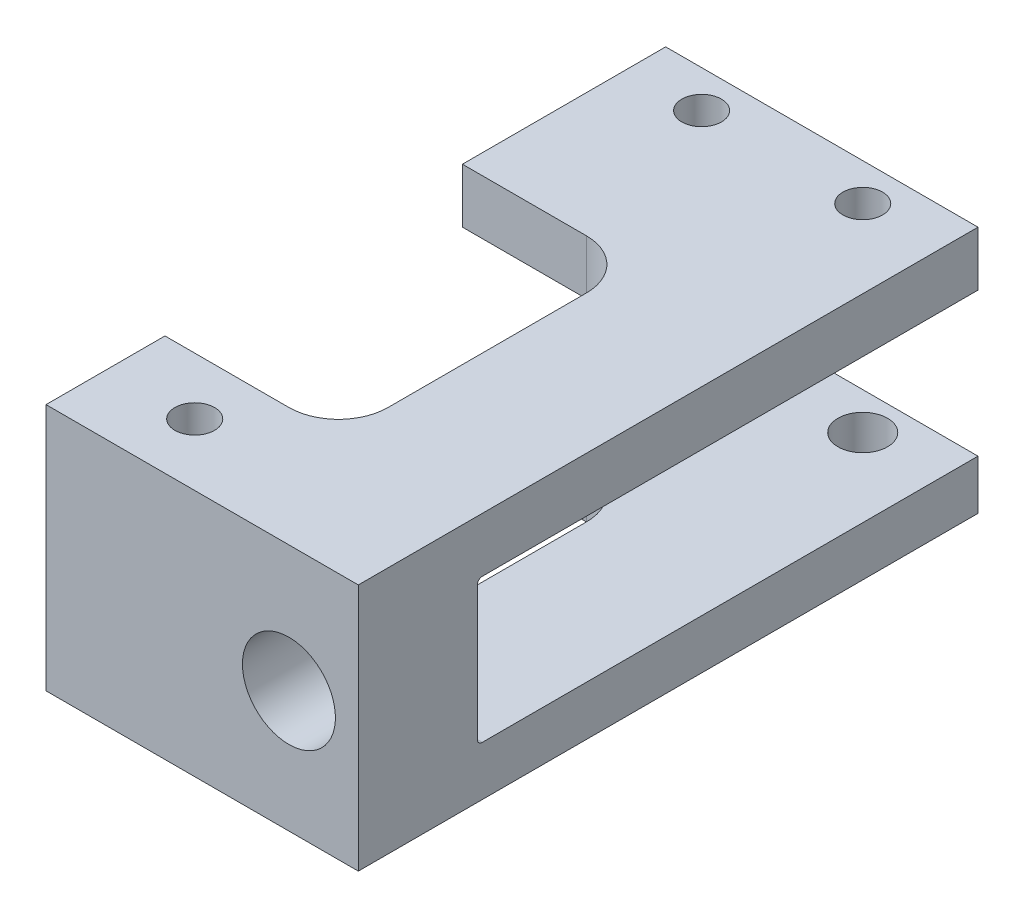
ISO-10303-21;
HEADER;
FILE_DESCRIPTION(('STEP AP214'),'2;1');
FILE_NAME('part.step','',(''),(''),'','','');
FILE_SCHEMA(('AUTOMOTIVE_DESIGN { 1 0 10303 214 1 1 1 1 }'));
ENDSEC;
DATA;
#1=APPLICATION_CONTEXT('core data for automotive mechanical design processes');
#2=APPLICATION_PROTOCOL_DEFINITION('international standard','automotive_design',2000,#1);
#3=PRODUCT_CONTEXT('',#1,'mechanical');
#4=PRODUCT('Part','Part','',(#3));
#5=PRODUCT_RELATED_PRODUCT_CATEGORY('part','',(#4));
#6=PRODUCT_DEFINITION_FORMATION('','',#4);
#7=PRODUCT_DEFINITION_CONTEXT('part definition',#1,'design');
#8=PRODUCT_DEFINITION('design','',#6,#7);
#9=PRODUCT_DEFINITION_SHAPE('','',#8);
#10=(LENGTH_UNIT() NAMED_UNIT(*) SI_UNIT(.MILLI.,.METRE.));
#11=(NAMED_UNIT(*) PLANE_ANGLE_UNIT() SI_UNIT($,.RADIAN.));
#12=(NAMED_UNIT(*) SI_UNIT($,.STERADIAN.) SOLID_ANGLE_UNIT());
#13=UNCERTAINTY_MEASURE_WITH_UNIT(LENGTH_MEASURE(1.E-05),#10,'distance_accuracy_value','');
#14=(GEOMETRIC_REPRESENTATION_CONTEXT(3) GLOBAL_UNCERTAINTY_ASSIGNED_CONTEXT((#13)) GLOBAL_UNIT_ASSIGNED_CONTEXT((#10,
#11,#12)) REPRESENTATION_CONTEXT('',''));
#15=CARTESIAN_POINT('',(0.,0.,0.));
#16=DIRECTION('',(0.,0.,1.));
#17=DIRECTION('',(1.,0.,0.));
#18=AXIS2_PLACEMENT_3D('',#15,#16,#17);
#19=CARTESIAN_POINT('',(-6.3,10.,12.5));
#20=DIRECTION('',(1.,0.,0.));
#21=DIRECTION('',(0.,0.,-1.));
#22=AXIS2_PLACEMENT_3D('',#19,#20,#21);
#23=PLANE('',#22);
#24=DIRECTION('',(0.,0.,1.));
#25=VECTOR('',#24,1.);
#26=CARTESIAN_POINT('',(-6.3,10.,12.5));
#27=LINE('',#26,#25);
#28=CARTESIAN_POINT('',(-6.3,10.,7.7));
#29=VERTEX_POINT('',#28);
#30=CARTESIAN_POINT('',(-6.3,10.,12.5));
#31=VERTEX_POINT('',#30);
#32=EDGE_CURVE('E212',#29,#31,#27,.T.);
#33=ORIENTED_EDGE('',*,*,#32,.F.);
#34=DIRECTION('',(0.,-1.,0.));
#35=VECTOR('',#34,1.);
#36=CARTESIAN_POINT('',(-6.3,7.8,7.7));
#37=LINE('',#36,#35);
#38=CARTESIAN_POINT('',(-6.3,0.,7.7));
#39=VERTEX_POINT('',#38);
#40=EDGE_CURVE('E447',#29,#39,#37,.T.);
#41=ORIENTED_EDGE('',*,*,#40,.T.);
#42=DIRECTION('',(0.,0.,1.));
#43=VECTOR('',#42,1.);
#44=CARTESIAN_POINT('',(-6.3,0.,12.5));
#45=LINE('',#44,#43);
#46=CARTESIAN_POINT('',(-6.3,0.,12.5));
#47=VERTEX_POINT('',#46);
#48=EDGE_CURVE('E229',#39,#47,#45,.T.);
#49=ORIENTED_EDGE('',*,*,#48,.T.);
#50=DIRECTION('',(0.,-1.,0.));
#51=VECTOR('',#50,1.);
#52=CARTESIAN_POINT('',(-6.3,10.,12.5));
#53=LINE('',#52,#51);
#54=EDGE_CURVE('E241',#31,#47,#53,.T.);
#55=ORIENTED_EDGE('',*,*,#54,.F.);
#56=EDGE_LOOP('',(#33,#41,#49,#55));
#57=FACE_BOUND('',#56,.T.);
#58=ADVANCED_FACE('F41',(#57),#23,.F.);
#59=CARTESIAN_POINT('',(-6.3,0.,-12.5));
#60=VERTEX_POINT('',#59);
#61=CARTESIAN_POINT('',(-6.3,0.,-4.3));
#62=VERTEX_POINT('',#61);
#63=EDGE_CURVE('E230',#60,#62,#45,.T.);
#64=ORIENTED_EDGE('',*,*,#63,.T.);
#65=DIRECTION('',(0.,1.,0.));
#66=VECTOR('',#65,1.);
#67=CARTESIAN_POINT('',(-6.3,0.,-4.3));
#68=LINE('',#67,#66);
#69=CARTESIAN_POINT('',(-6.3,2.,-4.3));
#70=VERTEX_POINT('',#69);
#71=EDGE_CURVE('E202',#62,#70,#68,.T.);
#72=ORIENTED_EDGE('',*,*,#71,.T.);
#73=DIRECTION('',(0.,0.,1.));
#74=VECTOR('',#73,1.);
#75=CARTESIAN_POINT('',(-6.3,2.,-12.5));
#76=LINE('',#75,#74);
#77=CARTESIAN_POINT('',(-6.3,2.,-12.5));
#78=VERTEX_POINT('',#77);
#79=EDGE_CURVE('E520',#78,#70,#76,.T.);
#80=ORIENTED_EDGE('',*,*,#79,.F.);
#81=DIRECTION('',(0.,-1.,0.));
#82=VECTOR('',#81,1.);
#83=CARTESIAN_POINT('',(-6.3,10.,-12.5));
#84=LINE('',#83,#82);
#85=EDGE_CURVE('E245',#78,#60,#84,.T.);
#86=ORIENTED_EDGE('',*,*,#85,.T.);
#87=EDGE_LOOP('',(#64,#72,#80,#86));
#88=FACE_BOUND('',#87,.T.);
#89=ADVANCED_FACE('F381',(#88),#23,.F.);
#90=CARTESIAN_POINT('',(-6.3,10.,-12.5));
#91=DIRECTION('',(0.,0.,1.));
#92=DIRECTION('',(1.,0.,0.));
#93=AXIS2_PLACEMENT_3D('',#90,#91,#92);
#94=PLANE('',#93);
#95=DIRECTION('',(0.,-1.,0.));
#96=VECTOR('',#95,1.);
#97=CARTESIAN_POINT('',(6.3,10.,-12.5));
#98=LINE('',#97,#96);
#99=CARTESIAN_POINT('',(6.3,10.,-12.5));
#100=VERTEX_POINT('',#99);
#101=CARTESIAN_POINT('',(6.3,7.8,-12.5));
#102=VERTEX_POINT('',#101);
#103=EDGE_CURVE('E250',#100,#102,#98,.T.);
#104=ORIENTED_EDGE('',*,*,#103,.T.);
#105=DIRECTION('',(-1.,0.,0.));
#106=VECTOR('',#105,1.);
#107=CARTESIAN_POINT('',(-6.3,7.8,-12.5));
#108=LINE('',#107,#106);
#109=CARTESIAN_POINT('',(-6.3,7.8,-12.5));
#110=VERTEX_POINT('',#109);
#111=EDGE_CURVE('E516',#102,#110,#108,.T.);
#112=ORIENTED_EDGE('',*,*,#111,.T.);
#113=CARTESIAN_POINT('',(-6.3,10.,-12.5));
#114=VERTEX_POINT('',#113);
#115=EDGE_CURVE('E246',#114,#110,#84,.T.);
#116=ORIENTED_EDGE('',*,*,#115,.F.);
#117=DIRECTION('',(-1.,0.,0.));
#118=VECTOR('',#117,1.);
#119=CARTESIAN_POINT('',(-6.3,10.,-12.5));
#120=LINE('',#119,#118);
#121=EDGE_CURVE('E208',#100,#114,#120,.T.);
#122=ORIENTED_EDGE('',*,*,#121,.F.);
#123=EDGE_LOOP('',(#104,#112,#116,#122));
#124=FACE_BOUND('',#123,.T.);
#125=ADVANCED_FACE('F374',(#124),#94,.F.);
#126=CARTESIAN_POINT('',(6.3,10.,12.5));
#127=DIRECTION('',(-1.,0.,0.));
#128=DIRECTION('',(0.,0.,1.));
#129=AXIS2_PLACEMENT_3D('',#126,#127,#128);
#130=PLANE('',#129);
#131=DIRECTION('',(0.,0.,1.));
#132=VECTOR('',#131,1.);
#133=CARTESIAN_POINT('',(6.3,2.,-12.5));
#134=LINE('',#133,#132);
#135=CARTESIAN_POINT('',(6.3,2.,-12.5));
#136=VERTEX_POINT('',#135);
#137=CARTESIAN_POINT('',(6.3,2.,7.5));
#138=VERTEX_POINT('',#137);
#139=EDGE_CURVE('E492',#136,#138,#134,.T.);
#140=ORIENTED_EDGE('',*,*,#139,.T.);
#141=CARTESIAN_POINT('',(6.3,2.2,7.5));
#142=DIRECTION('',(-1.,0.,0.));
#143=DIRECTION('',(0.,0.,1.));
#144=AXIS2_PLACEMENT_3D('',#141,#142,#143);
#145=CIRCLE('',#144,0.2);
#146=CARTESIAN_POINT('',(6.3,2.2,7.7));
#147=VERTEX_POINT('',#146);
#148=EDGE_CURVE('E334',#138,#147,#145,.T.);
#149=ORIENTED_EDGE('',*,*,#148,.T.);
#150=DIRECTION('',(0.,1.,0.));
#151=VECTOR('',#150,1.);
#152=CARTESIAN_POINT('',(6.3,2.,7.7));
#153=LINE('',#152,#151);
#154=CARTESIAN_POINT('',(6.3,7.6,7.7));
#155=VERTEX_POINT('',#154);
#156=EDGE_CURVE('E507',#147,#155,#153,.T.);
#157=ORIENTED_EDGE('',*,*,#156,.T.);
#158=CARTESIAN_POINT('',(6.3,7.6,7.5));
#159=DIRECTION('',(-1.,0.,0.));
#160=DIRECTION('',(0.,0.,1.));
#161=AXIS2_PLACEMENT_3D('',#158,#159,#160);
#162=CIRCLE('',#161,0.2);
#163=CARTESIAN_POINT('',(6.3,7.8,7.5));
#164=VERTEX_POINT('',#163);
#165=EDGE_CURVE('E11',#155,#164,#162,.T.);
#166=ORIENTED_EDGE('',*,*,#165,.T.);
#167=DIRECTION('',(0.,0.,-1.));
#168=VECTOR('',#167,1.);
#169=CARTESIAN_POINT('',(6.3,7.8,-12.5));
#170=LINE('',#169,#168);
#171=EDGE_CURVE('E510',#164,#102,#170,.T.);
#172=ORIENTED_EDGE('',*,*,#171,.T.);
#173=ORIENTED_EDGE('',*,*,#103,.F.);
#174=DIRECTION('',(0.,0.,-1.));
#175=VECTOR('',#174,1.);
#176=CARTESIAN_POINT('',(6.3,10.,12.5));
#177=LINE('',#176,#175);
#178=CARTESIAN_POINT('',(6.3,10.,12.5));
#179=VERTEX_POINT('',#178);
#180=EDGE_CURVE('E237',#179,#100,#177,.T.);
#181=ORIENTED_EDGE('',*,*,#180,.F.);
#182=DIRECTION('',(0.,-1.,0.));
#183=VECTOR('',#182,1.);
#184=CARTESIAN_POINT('',(6.3,10.,12.5));
#185=LINE('',#184,#183);
#186=CARTESIAN_POINT('',(6.3,0.,12.5));
#187=VERTEX_POINT('',#186);
#188=EDGE_CURVE('E216',#179,#187,#185,.T.);
#189=ORIENTED_EDGE('',*,*,#188,.T.);
#190=DIRECTION('',(0.,0.,-1.));
#191=VECTOR('',#190,1.);
#192=CARTESIAN_POINT('',(6.3,0.,12.5));
#193=LINE('',#192,#191);
#194=CARTESIAN_POINT('',(6.3,0.,-12.5));
#195=VERTEX_POINT('',#194);
#196=EDGE_CURVE('E221',#187,#195,#193,.T.);
#197=ORIENTED_EDGE('',*,*,#196,.T.);
#198=EDGE_CURVE('E249',#136,#195,#98,.T.);
#199=ORIENTED_EDGE('',*,*,#198,.F.);
#200=EDGE_LOOP('',(#140,#149,#157,#166,#172,#173,#181,#189,#197,#199));
#201=FACE_BOUND('',#200,.T.);
#202=ADVANCED_FACE('F370',(#201),#130,.F.);
#203=DIRECTION('',(1.,0.,0.));
#204=VECTOR('',#203,1.);
#205=CARTESIAN_POINT('',(-6.3,2.,-12.5));
#206=LINE('',#205,#204);
#207=EDGE_CURVE('E513',#78,#136,#206,.T.);
#208=ORIENTED_EDGE('',*,*,#207,.T.);
#209=ORIENTED_EDGE('',*,*,#198,.T.);
#210=DIRECTION('',(-1.,0.,0.));
#211=VECTOR('',#210,1.);
#212=CARTESIAN_POINT('',(-6.3,0.,-12.5));
#213=LINE('',#212,#211);
#214=EDGE_CURVE('E225',#195,#60,#213,.T.);
#215=ORIENTED_EDGE('',*,*,#214,.T.);
#216=ORIENTED_EDGE('',*,*,#85,.F.);
#217=EDGE_LOOP('',(#208,#209,#215,#216));
#218=FACE_BOUND('',#217,.T.);
#219=ADVANCED_FACE('F373',(#218),#94,.F.);
#220=DIRECTION('',(0.,0.,1.));
#221=VECTOR('',#220,1.);
#222=CARTESIAN_POINT('',(-6.3,7.8,-12.5));
#223=LINE('',#222,#221);
#224=CARTESIAN_POINT('',(-6.3,7.8,-4.3));
#225=VERTEX_POINT('',#224);
#226=EDGE_CURVE('E200',#110,#225,#223,.T.);
#227=ORIENTED_EDGE('',*,*,#226,.T.);
#228=CARTESIAN_POINT('',(-6.3,10.,-4.3));
#229=VERTEX_POINT('',#228);
#230=EDGE_CURVE('E185',#225,#229,#68,.T.);
#231=ORIENTED_EDGE('',*,*,#230,.T.);
#232=EDGE_CURVE('E199',#114,#229,#27,.T.);
#233=ORIENTED_EDGE('',*,*,#232,.F.);
#234=ORIENTED_EDGE('',*,*,#115,.T.);
#235=EDGE_LOOP('',(#227,#231,#233,#234));
#236=FACE_BOUND('',#235,.T.);
#237=ADVANCED_FACE('F197',(#236),#23,.F.);
#238=CARTESIAN_POINT('',(-6.3,10.,12.5));
#239=DIRECTION('',(0.,0.,-1.));
#240=DIRECTION('',(-1.,0.,0.));
#241=AXIS2_PLACEMENT_3D('',#238,#239,#240);
#242=PLANE('',#241);
#243=CARTESIAN_POINT('',(3.5,4.9,12.5));
#244=DIRECTION('',(0.,0.,-1.));
#245=DIRECTION('',(-1.,0.,0.));
#246=AXIS2_PLACEMENT_3D('',#243,#244,#245);
#247=CIRCLE('',#246,1.875);
#248=CARTESIAN_POINT('',(1.625,4.9,12.5));
#249=VERTEX_POINT('',#248);
#250=EDGE_CURVE('E540',#249,#249,#247,.T.);
#251=ORIENTED_EDGE('',*,*,#250,.T.);
#252=EDGE_LOOP('',(#251));
#253=FACE_BOUND('',#252,.T.);
#254=DIRECTION('',(1.,0.,0.));
#255=VECTOR('',#254,1.);
#256=CARTESIAN_POINT('',(-6.3,0.,12.5));
#257=LINE('',#256,#255);
#258=EDGE_CURVE('E234',#47,#187,#257,.T.);
#259=ORIENTED_EDGE('',*,*,#258,.T.);
#260=ORIENTED_EDGE('',*,*,#188,.F.);
#261=DIRECTION('',(1.,0.,0.));
#262=VECTOR('',#261,1.);
#263=CARTESIAN_POINT('',(-6.3,10.,12.5));
#264=LINE('',#263,#262);
#265=EDGE_CURVE('E211',#31,#179,#264,.T.);
#266=ORIENTED_EDGE('',*,*,#265,.F.);
#267=ORIENTED_EDGE('',*,*,#54,.T.);
#268=EDGE_LOOP('',(#259,#260,#266,#267));
#269=FACE_BOUND('',#268,.T.);
#270=ADVANCED_FACE('F380',(#253,#269),#242,.F.);
#271=CARTESIAN_POINT('',(0.,10.,0.));
#272=DIRECTION('',(0.,-1.,0.));
#273=DIRECTION('',(0.,0.,-1.));
#274=AXIS2_PLACEMENT_3D('',#271,#272,#273);
#275=PLANE('',#274);
#276=CARTESIAN_POINT('',(-2.8,10.,10.));
#277=DIRECTION('',(0.,1.,0.));
#278=DIRECTION('',(0.,0.,1.));
#279=AXIS2_PLACEMENT_3D('',#276,#277,#278);
#280=CIRCLE('',#279,0.799999999999999);
#281=CARTESIAN_POINT('',(-2.8,10.,10.8));
#282=VERTEX_POINT('',#281);
#283=EDGE_CURVE('E553',#282,#282,#280,.T.);
#284=ORIENTED_EDGE('',*,*,#283,.F.);
#285=EDGE_LOOP('',(#284));
#286=FACE_BOUND('',#285,.T.);
#287=CARTESIAN_POINT('',(3.15,10.,-11.));
#288=DIRECTION('',(0.,1.,0.));
#289=DIRECTION('',(0.,0.,1.));
#290=AXIS2_PLACEMENT_3D('',#287,#288,#289);
#291=CIRCLE('',#290,0.799999999999988);
#292=CARTESIAN_POINT('',(3.15,10.,-10.2));
#293=VERTEX_POINT('',#292);
#294=EDGE_CURVE('E265',#293,#293,#291,.T.);
#295=ORIENTED_EDGE('',*,*,#294,.F.);
#296=EDGE_LOOP('',(#295));
#297=FACE_BOUND('',#296,.T.);
#298=CARTESIAN_POINT('',(-3.35,10.,-11.));
#299=DIRECTION('',(0.,1.,0.));
#300=DIRECTION('',(0.,0.,1.));
#301=AXIS2_PLACEMENT_3D('',#298,#299,#300);
#302=CIRCLE('',#301,0.799999999999988);
#303=CARTESIAN_POINT('',(-3.35,10.,-10.2));
#304=VERTEX_POINT('',#303);
#305=EDGE_CURVE('E260',#304,#304,#302,.T.);
#306=ORIENTED_EDGE('',*,*,#305,.F.);
#307=EDGE_LOOP('',(#306));
#308=FACE_BOUND('',#307,.T.);
#309=DIRECTION('',(0.,0.,-1.));
#310=VECTOR('',#309,1.);
#311=CARTESIAN_POINT('',(0.700000000000001,10.,7.7));
#312=LINE('',#311,#310);
#313=CARTESIAN_POINT('',(0.700000000000001,10.,5.7));
#314=VERTEX_POINT('',#313);
#315=CARTESIAN_POINT('',(0.700000000000001,10.,-2.3));
#316=VERTEX_POINT('',#315);
#317=EDGE_CURVE('E193',#314,#316,#312,.T.);
#318=ORIENTED_EDGE('',*,*,#317,.F.);
#319=CARTESIAN_POINT('',(-1.3,10.,5.7));
#320=DIRECTION('',(0.,-1.,0.));
#321=DIRECTION('',(0.,0.,-1.));
#322=AXIS2_PLACEMENT_3D('',#319,#320,#321);
#323=CIRCLE('',#322,2.);
#324=CARTESIAN_POINT('',(-1.3,10.,7.7));
#325=VERTEX_POINT('',#324);
#326=EDGE_CURVE('E301',#314,#325,#323,.T.);
#327=ORIENTED_EDGE('',*,*,#326,.T.);
#328=DIRECTION('',(1.,0.,0.));
#329=VECTOR('',#328,1.);
#330=CARTESIAN_POINT('',(0.700000000000001,10.,7.7));
#331=LINE('',#330,#329);
#332=EDGE_CURVE('E192',#29,#325,#331,.T.);
#333=ORIENTED_EDGE('',*,*,#332,.F.);
#334=ORIENTED_EDGE('',*,*,#32,.T.);
#335=ORIENTED_EDGE('',*,*,#265,.T.);
#336=ORIENTED_EDGE('',*,*,#180,.T.);
#337=ORIENTED_EDGE('',*,*,#121,.T.);
#338=ORIENTED_EDGE('',*,*,#232,.T.);
#339=DIRECTION('',(-1.,0.,0.));
#340=VECTOR('',#339,1.);
#341=CARTESIAN_POINT('',(0.700000000000001,10.,-4.3));
#342=LINE('',#341,#340);
#343=CARTESIAN_POINT('',(-1.3,10.,-4.3));
#344=VERTEX_POINT('',#343);
#345=EDGE_CURVE('E181',#344,#229,#342,.T.);
#346=ORIENTED_EDGE('',*,*,#345,.F.);
#347=CARTESIAN_POINT('',(-1.3,10.,-2.3));
#348=DIRECTION('',(0.,-1.,0.));
#349=DIRECTION('',(0.,0.,-1.));
#350=AXIS2_PLACEMENT_3D('',#347,#348,#349);
#351=CIRCLE('',#350,2.);
#352=EDGE_CURVE('E295',#344,#316,#351,.T.);
#353=ORIENTED_EDGE('',*,*,#352,.T.);
#354=EDGE_LOOP('',(#318,#327,#333,#334,#335,#336,#337,#338,#346,#353));
#355=FACE_BOUND('',#354,.T.);
#356=ADVANCED_FACE('F206',(#286,#297,#308,#355),#275,.F.);
#357=CARTESIAN_POINT('',(0.,0.,0.));
#358=DIRECTION('',(0.,-1.,0.));
#359=DIRECTION('',(0.,0.,-1.));
#360=AXIS2_PLACEMENT_3D('',#357,#358,#359);
#361=PLANE('',#360);
#362=CARTESIAN_POINT('',(-2.8,0.,10.));
#363=DIRECTION('',(0.,1.,0.));
#364=DIRECTION('',(0.,0.,1.));
#365=AXIS2_PLACEMENT_3D('',#362,#363,#364);
#366=CIRCLE('',#365,0.799999999999997);
#367=CARTESIAN_POINT('',(-2.8,0.,10.8));
#368=VERTEX_POINT('',#367);
#369=EDGE_CURVE('E548',#368,#368,#366,.T.);
#370=ORIENTED_EDGE('',*,*,#369,.T.);
#371=EDGE_LOOP('',(#370));
#372=FACE_BOUND('',#371,.T.);
#373=DIRECTION('',(1.,0.,0.));
#374=VECTOR('',#373,1.);
#375=CARTESIAN_POINT('',(0.700000000000001,0.,7.7));
#376=LINE('',#375,#374);
#377=CARTESIAN_POINT('',(-1.3,0.,7.7));
#378=VERTEX_POINT('',#377);
#379=EDGE_CURVE('E203',#39,#378,#376,.T.);
#380=ORIENTED_EDGE('',*,*,#379,.T.);
#381=CARTESIAN_POINT('',(-1.3,0.,5.7));
#382=DIRECTION('',(0.,-1.,0.));
#383=DIRECTION('',(0.,0.,-1.));
#384=AXIS2_PLACEMENT_3D('',#381,#382,#383);
#385=CIRCLE('',#384,2.);
#386=CARTESIAN_POINT('',(0.700000000000001,0.,5.7));
#387=VERTEX_POINT('',#386);
#388=EDGE_CURVE('E317',#378,#387,#385,.F.);
#389=ORIENTED_EDGE('',*,*,#388,.T.);
#390=DIRECTION('',(0.,0.,-1.));
#391=VECTOR('',#390,1.);
#392=CARTESIAN_POINT('',(0.700000000000001,0.,7.7));
#393=LINE('',#392,#391);
#394=CARTESIAN_POINT('',(0.700000000000001,0.,-2.3));
#395=VERTEX_POINT('',#394);
#396=EDGE_CURVE('E456',#387,#395,#393,.T.);
#397=ORIENTED_EDGE('',*,*,#396,.T.);
#398=CARTESIAN_POINT('',(-1.3,0.,-2.3));
#399=DIRECTION('',(0.,-1.,0.));
#400=DIRECTION('',(0.,0.,-1.));
#401=AXIS2_PLACEMENT_3D('',#398,#399,#400);
#402=CIRCLE('',#401,2.);
#403=CARTESIAN_POINT('',(-1.3,0.,-4.3));
#404=VERTEX_POINT('',#403);
#405=EDGE_CURVE('E310',#395,#404,#402,.F.);
#406=ORIENTED_EDGE('',*,*,#405,.T.);
#407=DIRECTION('',(-1.,0.,0.));
#408=VECTOR('',#407,1.);
#409=CARTESIAN_POINT('',(0.700000000000001,0.,-4.3));
#410=LINE('',#409,#408);
#411=EDGE_CURVE('E460',#404,#62,#410,.T.);
#412=ORIENTED_EDGE('',*,*,#411,.T.);
#413=ORIENTED_EDGE('',*,*,#63,.F.);
#414=ORIENTED_EDGE('',*,*,#214,.F.);
#415=ORIENTED_EDGE('',*,*,#196,.F.);
#416=ORIENTED_EDGE('',*,*,#258,.F.);
#417=ORIENTED_EDGE('',*,*,#48,.F.);
#418=EDGE_LOOP('',(#380,#389,#397,#406,#412,#413,#414,#415,#416,#417));
#419=FACE_BOUND('',#418,.T.);
#420=CARTESIAN_POINT('',(3.15,0.,-11.));
#421=DIRECTION('',(0.,1.,0.));
#422=DIRECTION('',(0.,0.,1.));
#423=AXIS2_PLACEMENT_3D('',#420,#421,#422);
#424=CIRCLE('',#423,1.);
#425=CARTESIAN_POINT('',(3.15,0.,-10.));
#426=VERTEX_POINT('',#425);
#427=EDGE_CURVE('E488',#426,#426,#424,.T.);
#428=ORIENTED_EDGE('',*,*,#427,.T.);
#429=EDGE_LOOP('',(#428));
#430=FACE_BOUND('',#429,.T.);
#431=CARTESIAN_POINT('',(-3.35,0.,-11.));
#432=DIRECTION('',(0.,1.,0.));
#433=DIRECTION('',(0.,0.,1.));
#434=AXIS2_PLACEMENT_3D('',#431,#432,#433);
#435=CIRCLE('',#434,1.);
#436=CARTESIAN_POINT('',(-3.35,0.,-10.));
#437=VERTEX_POINT('',#436);
#438=EDGE_CURVE('E497',#437,#437,#435,.T.);
#439=ORIENTED_EDGE('',*,*,#438,.T.);
#440=EDGE_LOOP('',(#439));
#441=FACE_BOUND('',#440,.T.);
#442=ADVANCED_FACE('F385',(#372,#419,#430,#441),#361,.T.);
#443=CARTESIAN_POINT('',(-6.3,7.8,-12.5));
#444=DIRECTION('',(0.,1.,0.));
#445=DIRECTION('',(0.,0.,1.));
#446=AXIS2_PLACEMENT_3D('',#443,#444,#445);
#447=PLANE('',#446);
#448=CARTESIAN_POINT('',(3.15,7.8,-11.));
#449=DIRECTION('',(0.,1.,0.));
#450=DIRECTION('',(0.,0.,1.));
#451=AXIS2_PLACEMENT_3D('',#448,#449,#450);
#452=CIRCLE('',#451,0.799999999999993);
#453=CARTESIAN_POINT('',(3.15,7.8,-10.2));
#454=VERTEX_POINT('',#453);
#455=EDGE_CURVE('E261',#454,#454,#452,.T.);
#456=ORIENTED_EDGE('',*,*,#455,.T.);
#457=EDGE_LOOP('',(#456));
#458=FACE_BOUND('',#457,.T.);
#459=CARTESIAN_POINT('',(-3.35,7.8,-11.));
#460=DIRECTION('',(0.,1.,0.));
#461=DIRECTION('',(0.,0.,1.));
#462=AXIS2_PLACEMENT_3D('',#459,#460,#461);
#463=CIRCLE('',#462,0.799999999999993);
#464=CARTESIAN_POINT('',(-3.35,7.8,-10.2));
#465=VERTEX_POINT('',#464);
#466=EDGE_CURVE('E255',#465,#465,#463,.T.);
#467=ORIENTED_EDGE('',*,*,#466,.T.);
#468=EDGE_LOOP('',(#467));
#469=FACE_BOUND('',#468,.T.);
#470=ORIENTED_EDGE('',*,*,#171,.F.);
#471=DIRECTION('',(-1.,0.,0.));
#472=VECTOR('',#471,1.);
#473=CARTESIAN_POINT('',(-1.3,7.8,7.5));
#474=LINE('',#473,#472);
#475=CARTESIAN_POINT('',(-0.428220211291869,7.8,7.5));
#476=VERTEX_POINT('',#475);
#477=EDGE_CURVE('E331',#164,#476,#474,.T.);
#478=ORIENTED_EDGE('',*,*,#477,.T.);
#479=CARTESIAN_POINT('',(-1.3,7.8,5.7));
#480=DIRECTION('',(0.,1.,0.));
#481=DIRECTION('',(0.,0.,1.));
#482=AXIS2_PLACEMENT_3D('',#479,#480,#481);
#483=CIRCLE('',#482,2.);
#484=CARTESIAN_POINT('',(0.700000000000001,7.8,5.7));
#485=VERTEX_POINT('',#484);
#486=EDGE_CURVE('E304',#476,#485,#483,.T.);
#487=ORIENTED_EDGE('',*,*,#486,.T.);
#488=DIRECTION('',(0.,0.,-1.));
#489=VECTOR('',#488,1.);
#490=CARTESIAN_POINT('',(0.700000000000001,7.8,-12.5));
#491=LINE('',#490,#489);
#492=CARTESIAN_POINT('',(0.700000000000001,7.8,-2.3));
#493=VERTEX_POINT('',#492);
#494=EDGE_CURVE('E475',#485,#493,#491,.T.);
#495=ORIENTED_EDGE('',*,*,#494,.T.);
#496=CARTESIAN_POINT('',(-1.3,7.8,-2.3));
#497=DIRECTION('',(0.,1.,0.));
#498=DIRECTION('',(0.,0.,1.));
#499=AXIS2_PLACEMENT_3D('',#496,#497,#498);
#500=CIRCLE('',#499,2.);
#501=CARTESIAN_POINT('',(-1.3,7.8,-4.3));
#502=VERTEX_POINT('',#501);
#503=EDGE_CURVE('E298',#493,#502,#500,.T.);
#504=ORIENTED_EDGE('',*,*,#503,.T.);
#505=DIRECTION('',(-1.,0.,0.));
#506=VECTOR('',#505,1.);
#507=CARTESIAN_POINT('',(-6.3,7.8,-4.3));
#508=LINE('',#507,#506);
#509=EDGE_CURVE('E479',#502,#225,#508,.T.);
#510=ORIENTED_EDGE('',*,*,#509,.T.);
#511=ORIENTED_EDGE('',*,*,#226,.F.);
#512=ORIENTED_EDGE('',*,*,#111,.F.);
#513=EDGE_LOOP('',(#470,#478,#487,#495,#504,#510,#511,#512));
#514=FACE_BOUND('',#513,.T.);
#515=ADVANCED_FACE('F388',(#458,#469,#514),#447,.F.);
#516=CARTESIAN_POINT('',(-6.3,2.,-12.5));
#517=DIRECTION('',(0.,-1.,0.));
#518=DIRECTION('',(0.,0.,-1.));
#519=AXIS2_PLACEMENT_3D('',#516,#517,#518);
#520=PLANE('',#519);
#521=CARTESIAN_POINT('',(3.15,2.,-11.));
#522=DIRECTION('',(0.,1.,0.));
#523=DIRECTION('',(0.,0.,1.));
#524=AXIS2_PLACEMENT_3D('',#521,#522,#523);
#525=CIRCLE('',#524,1.);
#526=CARTESIAN_POINT('',(3.15,2.,-10.));
#527=VERTEX_POINT('',#526);
#528=EDGE_CURVE('E493',#527,#527,#525,.T.);
#529=ORIENTED_EDGE('',*,*,#528,.F.);
#530=EDGE_LOOP('',(#529));
#531=FACE_BOUND('',#530,.T.);
#532=CARTESIAN_POINT('',(-3.35,2.,-11.));
#533=DIRECTION('',(0.,1.,0.));
#534=DIRECTION('',(0.,0.,1.));
#535=AXIS2_PLACEMENT_3D('',#532,#533,#534);
#536=CIRCLE('',#535,1.);
#537=CARTESIAN_POINT('',(-3.35,2.,-10.));
#538=VERTEX_POINT('',#537);
#539=EDGE_CURVE('E259',#538,#538,#536,.T.);
#540=ORIENTED_EDGE('',*,*,#539,.F.);
#541=EDGE_LOOP('',(#540));
#542=FACE_BOUND('',#541,.T.);
#543=CARTESIAN_POINT('',(-1.3,2.,5.7));
#544=DIRECTION('',(0.,-1.,0.));
#545=DIRECTION('',(0.,0.,-1.));
#546=AXIS2_PLACEMENT_3D('',#543,#544,#545);
#547=CIRCLE('',#546,2.);
#548=CARTESIAN_POINT('',(0.700000000000001,2.,5.7));
#549=VERTEX_POINT('',#548);
#550=CARTESIAN_POINT('',(-0.428220211291869,2.,7.5));
#551=VERTEX_POINT('',#550);
#552=EDGE_CURVE('E313',#549,#551,#547,.T.);
#553=ORIENTED_EDGE('',*,*,#552,.T.);
#554=DIRECTION('',(1.,0.,0.));
#555=VECTOR('',#554,1.);
#556=CARTESIAN_POINT('',(6.3,2.,7.5));
#557=LINE('',#556,#555);
#558=EDGE_CURVE('E320',#551,#138,#557,.T.);
#559=ORIENTED_EDGE('',*,*,#558,.T.);
#560=ORIENTED_EDGE('',*,*,#139,.F.);
#561=ORIENTED_EDGE('',*,*,#207,.F.);
#562=ORIENTED_EDGE('',*,*,#79,.T.);
#563=DIRECTION('',(1.,0.,0.));
#564=VECTOR('',#563,1.);
#565=CARTESIAN_POINT('',(-6.3,2.,-4.3));
#566=LINE('',#565,#564);
#567=CARTESIAN_POINT('',(-1.3,2.,-4.3));
#568=VERTEX_POINT('',#567);
#569=EDGE_CURVE('E254',#70,#568,#566,.T.);
#570=ORIENTED_EDGE('',*,*,#569,.T.);
#571=CARTESIAN_POINT('',(-1.3,2.,-2.3));
#572=DIRECTION('',(0.,-1.,0.));
#573=DIRECTION('',(0.,0.,-1.));
#574=AXIS2_PLACEMENT_3D('',#571,#572,#573);
#575=CIRCLE('',#574,2.);
#576=CARTESIAN_POINT('',(0.700000000000001,2.,-2.3));
#577=VERTEX_POINT('',#576);
#578=EDGE_CURVE('E307',#568,#577,#575,.T.);
#579=ORIENTED_EDGE('',*,*,#578,.T.);
#580=DIRECTION('',(0.,0.,1.));
#581=VECTOR('',#580,1.);
#582=CARTESIAN_POINT('',(0.700000000000001,2.,-12.5));
#583=LINE('',#582,#581);
#584=EDGE_CURVE('E471',#577,#549,#583,.T.);
#585=ORIENTED_EDGE('',*,*,#584,.T.);
#586=EDGE_LOOP('',(#553,#559,#560,#561,#562,#570,#579,#585));
#587=FACE_BOUND('',#586,.T.);
#588=ADVANCED_FACE('F393',(#531,#542,#587),#520,.F.);
#589=CARTESIAN_POINT('',(0.,0.,7.7));
#590=DIRECTION('',(0.,0.,1.));
#591=DIRECTION('',(1.,0.,0.));
#592=AXIS2_PLACEMENT_3D('',#589,#590,#591);
#593=PLANE('',#592);
#594=CARTESIAN_POINT('',(3.5,4.9,7.7));
#595=DIRECTION('',(0.,0.,-1.));
#596=DIRECTION('',(-1.,0.,0.));
#597=AXIS2_PLACEMENT_3D('',#594,#595,#596);
#598=CIRCLE('',#597,1.875);
#599=CARTESIAN_POINT('',(1.625,4.9,7.7));
#600=VERTEX_POINT('',#599);
#601=EDGE_CURVE('E543',#600,#600,#598,.T.);
#602=ORIENTED_EDGE('',*,*,#601,.F.);
#603=EDGE_LOOP('',(#602));
#604=FACE_BOUND('',#603,.T.);
#605=ORIENTED_EDGE('',*,*,#156,.F.);
#606=DIRECTION('',(1.,0.,0.));
#607=VECTOR('',#606,1.);
#608=CARTESIAN_POINT('',(-1.3,2.2,7.7));
#609=LINE('',#608,#607);
#610=CARTESIAN_POINT('',(-1.3,2.2,7.7));
#611=VERTEX_POINT('',#610);
#612=EDGE_CURVE('E327',#147,#611,#609,.F.);
#613=ORIENTED_EDGE('',*,*,#612,.T.);
#614=DIRECTION('',(0.,1.,0.));
#615=VECTOR('',#614,1.);
#616=CARTESIAN_POINT('',(-1.3,0.,7.7));
#617=LINE('',#616,#615);
#618=EDGE_CURVE('E278',#611,#378,#617,.F.);
#619=ORIENTED_EDGE('',*,*,#618,.T.);
#620=ORIENTED_EDGE('',*,*,#379,.F.);
#621=ORIENTED_EDGE('',*,*,#40,.F.);
#622=ORIENTED_EDGE('',*,*,#332,.T.);
#623=DIRECTION('',(0.,1.,0.));
#624=VECTOR('',#623,1.);
#625=CARTESIAN_POINT('',(-1.3,7.8,7.7));
#626=LINE('',#625,#624);
#627=CARTESIAN_POINT('',(-1.3,7.6,7.7));
#628=VERTEX_POINT('',#627);
#629=EDGE_CURVE('E281',#325,#628,#626,.F.);
#630=ORIENTED_EDGE('',*,*,#629,.T.);
#631=DIRECTION('',(-1.,0.,0.));
#632=VECTOR('',#631,1.);
#633=CARTESIAN_POINT('',(6.3,7.6,7.7));
#634=LINE('',#633,#632);
#635=EDGE_CURVE('E324',#628,#155,#634,.F.);
#636=ORIENTED_EDGE('',*,*,#635,.T.);
#637=EDGE_LOOP('',(#605,#613,#619,#620,#621,#622,#630,#636));
#638=FACE_BOUND('',#637,.T.);
#639=ADVANCED_FACE('F396',(#604,#638),#593,.F.);
#640=CARTESIAN_POINT('',(-3.35,0.,-11.));
#641=DIRECTION('',(0.,1.,0.));
#642=DIRECTION('',(0.,0.,1.));
#643=AXIS2_PLACEMENT_3D('',#640,#641,#642);
#644=CYLINDRICAL_SURFACE('',#643,1.);
#645=ORIENTED_EDGE('',*,*,#438,.F.);
#646=EDGE_LOOP('',(#645));
#647=FACE_BOUND('',#646,.T.);
#648=ORIENTED_EDGE('',*,*,#539,.T.);
#649=EDGE_LOOP('',(#648));
#650=FACE_BOUND('',#649,.T.);
#651=ADVANCED_FACE('F403',(#647,#650),#644,.F.);
#652=CARTESIAN_POINT('',(3.15,0.,-11.));
#653=DIRECTION('',(0.,1.,0.));
#654=DIRECTION('',(0.,0.,1.));
#655=AXIS2_PLACEMENT_3D('',#652,#653,#654);
#656=CYLINDRICAL_SURFACE('',#655,1.);
#657=ORIENTED_EDGE('',*,*,#427,.F.);
#658=EDGE_LOOP('',(#657));
#659=FACE_BOUND('',#658,.T.);
#660=ORIENTED_EDGE('',*,*,#528,.T.);
#661=EDGE_LOOP('',(#660));
#662=FACE_BOUND('',#661,.T.);
#663=ADVANCED_FACE('F407',(#659,#662),#656,.F.);
#664=CARTESIAN_POINT('',(-3.35,10.,-11.));
#665=DIRECTION('',(0.,1.,0.));
#666=DIRECTION('',(0.,0.,1.));
#667=AXIS2_PLACEMENT_3D('',#664,#665,#666);
#668=CYLINDRICAL_SURFACE('',#667,0.799999999999993);
#669=ORIENTED_EDGE('',*,*,#305,.T.);
#670=EDGE_LOOP('',(#669));
#671=FACE_BOUND('',#670,.T.);
#672=ORIENTED_EDGE('',*,*,#466,.F.);
#673=EDGE_LOOP('',(#672));
#674=FACE_BOUND('',#673,.T.);
#675=ADVANCED_FACE('F411',(#671,#674),#668,.F.);
#676=CARTESIAN_POINT('',(3.15,10.,-11.));
#677=DIRECTION('',(0.,1.,0.));
#678=DIRECTION('',(0.,0.,1.));
#679=AXIS2_PLACEMENT_3D('',#676,#677,#678);
#680=CYLINDRICAL_SURFACE('',#679,0.799999999999993);
#681=ORIENTED_EDGE('',*,*,#294,.T.);
#682=EDGE_LOOP('',(#681));
#683=FACE_BOUND('',#682,.T.);
#684=ORIENTED_EDGE('',*,*,#455,.F.);
#685=EDGE_LOOP('',(#684));
#686=FACE_BOUND('',#685,.T.);
#687=ADVANCED_FACE('F415',(#683,#686),#680,.F.);
#688=CARTESIAN_POINT('',(0.700000000000001,0.,-4.3));
#689=DIRECTION('',(0.,0.,-1.));
#690=DIRECTION('',(-1.,0.,0.));
#691=AXIS2_PLACEMENT_3D('',#688,#689,#690);
#692=PLANE('',#691);
#693=ORIENTED_EDGE('',*,*,#411,.F.);
#694=DIRECTION('',(0.,1.,0.));
#695=VECTOR('',#694,1.);
#696=CARTESIAN_POINT('',(-1.3,2.,-4.3));
#697=LINE('',#696,#695);
#698=EDGE_CURVE('E284',#404,#568,#697,.T.);
#699=ORIENTED_EDGE('',*,*,#698,.T.);
#700=ORIENTED_EDGE('',*,*,#569,.F.);
#701=ORIENTED_EDGE('',*,*,#71,.F.);
#702=EDGE_LOOP('',(#693,#699,#700,#701));
#703=FACE_BOUND('',#702,.T.);
#704=ADVANCED_FACE('F419',(#703),#692,.F.);
#705=CARTESIAN_POINT('',(0.700000000000001,0.,7.7));
#706=DIRECTION('',(1.,0.,0.));
#707=DIRECTION('',(0.,0.,-1.));
#708=AXIS2_PLACEMENT_3D('',#705,#706,#707);
#709=PLANE('',#708);
#710=ORIENTED_EDGE('',*,*,#584,.F.);
#711=DIRECTION('',(0.,1.,0.));
#712=VECTOR('',#711,1.);
#713=CARTESIAN_POINT('',(0.700000000000001,0.,-2.3));
#714=LINE('',#713,#712);
#715=EDGE_CURVE('E292',#577,#395,#714,.F.);
#716=ORIENTED_EDGE('',*,*,#715,.T.);
#717=ORIENTED_EDGE('',*,*,#396,.F.);
#718=DIRECTION('',(0.,1.,0.));
#719=VECTOR('',#718,1.);
#720=CARTESIAN_POINT('',(0.700000000000001,2.,5.7));
#721=LINE('',#720,#719);
#722=EDGE_CURVE('E288',#387,#549,#721,.T.);
#723=ORIENTED_EDGE('',*,*,#722,.T.);
#724=EDGE_LOOP('',(#710,#716,#717,#723));
#725=FACE_BOUND('',#724,.T.);
#726=ADVANCED_FACE('F424',(#725),#709,.F.);
#727=ORIENTED_EDGE('',*,*,#509,.F.);
#728=DIRECTION('',(0.,1.,0.));
#729=VECTOR('',#728,1.);
#730=CARTESIAN_POINT('',(-1.3,10.,-4.3));
#731=LINE('',#730,#729);
#732=EDGE_CURVE('E188',#502,#344,#731,.T.);
#733=ORIENTED_EDGE('',*,*,#732,.T.);
#734=ORIENTED_EDGE('',*,*,#345,.T.);
#735=ORIENTED_EDGE('',*,*,#230,.F.);
#736=EDGE_LOOP('',(#727,#733,#734,#735));
#737=FACE_BOUND('',#736,.T.);
#738=ADVANCED_FACE('F184',(#737),#692,.F.);
#739=ORIENTED_EDGE('',*,*,#317,.T.);
#740=DIRECTION('',(0.,1.,0.));
#741=VECTOR('',#740,1.);
#742=CARTESIAN_POINT('',(0.700000000000001,7.8,-2.3));
#743=LINE('',#742,#741);
#744=EDGE_CURVE('E275',#316,#493,#743,.F.);
#745=ORIENTED_EDGE('',*,*,#744,.T.);
#746=ORIENTED_EDGE('',*,*,#494,.F.);
#747=DIRECTION('',(0.,1.,0.));
#748=VECTOR('',#747,1.);
#749=CARTESIAN_POINT('',(0.700000000000001,10.,5.7));
#750=LINE('',#749,#748);
#751=EDGE_CURVE('E271',#485,#314,#750,.T.);
#752=ORIENTED_EDGE('',*,*,#751,.T.);
#753=EDGE_LOOP('',(#739,#745,#746,#752));
#754=FACE_BOUND('',#753,.T.);
#755=ADVANCED_FACE('F368',(#754),#709,.F.);
#756=CARTESIAN_POINT('',(-1.3,0.,-2.3));
#757=DIRECTION('',(0.,-1.,0.));
#758=DIRECTION('',(0.,0.,-1.));
#759=AXIS2_PLACEMENT_3D('',#756,#757,#758);
#760=CYLINDRICAL_SURFACE('',#759,2.);
#761=ORIENTED_EDGE('',*,*,#503,.F.);
#762=ORIENTED_EDGE('',*,*,#744,.F.);
#763=ORIENTED_EDGE('',*,*,#352,.F.);
#764=ORIENTED_EDGE('',*,*,#732,.F.);
#765=EDGE_LOOP('',(#761,#762,#763,#764));
#766=FACE_BOUND('',#765,.T.);
#767=ADVANCED_FACE('F364',(#766),#760,.F.);
#768=CARTESIAN_POINT('',(-1.3,0.,5.7));
#769=DIRECTION('',(0.,-1.,0.));
#770=DIRECTION('',(0.,0.,-1.));
#771=AXIS2_PLACEMENT_3D('',#768,#769,#770);
#772=CYLINDRICAL_SURFACE('',#771,2.);
#773=ORIENTED_EDGE('',*,*,#486,.F.);
#774=CARTESIAN_POINT('',(-0.428220211291869,7.8,7.5));
#775=CARTESIAN_POINT('',(-0.45715973805367,7.79996175848643,7.51401989347998));
#776=CARTESIAN_POINT('',(-0.486397643908612,7.79853097766287,7.52731514344287));
#777=CARTESIAN_POINT('',(-0.545259573796734,7.79344547447464,7.55239964672805));
#778=CARTESIAN_POINT('',(-0.574882700443705,7.78979524201771,7.56419188251238));
#779=CARTESIAN_POINT('',(-0.634300425359317,7.78084569659502,7.5862252177533));
#780=CARTESIAN_POINT('',(-0.664093824432566,7.77555319891199,7.59647247231074));
#781=CARTESIAN_POINT('',(-0.723907072855265,7.76366928600009,7.61549003734659));
#782=CARTESIAN_POINT('',(-0.753927054696698,7.75707704322899,7.62425940022533));
#783=CARTESIAN_POINT('',(-0.867852036408319,7.73025957335495,7.65468099468993));
#784=CARTESIAN_POINT('',(-0.952320236739531,7.70669847567466,7.67139796247726));
#785=CARTESIAN_POINT('',(-1.1217045940587,7.65633312825506,7.69387001418937));
#786=CARTESIAN_POINT('',(-1.20662092710591,7.62952749641819,7.69962040900359));
#787=CARTESIAN_POINT('',(-1.29431471388528,7.60179784190903,7.69999392629444));
#788=CARTESIAN_POINT('',(-1.29715739869525,7.60089890510664,7.6999999857086));
#789=CARTESIAN_POINT('',(-1.3,7.6,7.7));
#790=B_SPLINE_CURVE_WITH_KNOTS('',3,(#774,#775,#776,#777,#778,#779,#780,#781,#782,#783,#784,
#785,#786,#787,#788,#789),.UNSPECIFIED.,.F.,.F.,(4,2,2,2,2,2,2,4),(0.,0.0963647872284005,
0.192535275967189,0.288311884280232,0.384149671235461,0.651005986217638,0.917976378629925,
0.926920669114513),.UNSPECIFIED.);
#791=EDGE_CURVE('E51',#476,#628,#790,.T.);
#792=ORIENTED_EDGE('',*,*,#791,.T.);
#793=ORIENTED_EDGE('',*,*,#629,.F.);
#794=ORIENTED_EDGE('',*,*,#326,.F.);
#795=ORIENTED_EDGE('',*,*,#751,.F.);
#796=EDGE_LOOP('',(#773,#792,#793,#794,#795));
#797=FACE_BOUND('',#796,.T.);
#798=ADVANCED_FACE('F359',(#797),#772,.F.);
#799=CARTESIAN_POINT('',(-1.3,0.,-2.3));
#800=DIRECTION('',(0.,-1.,0.));
#801=DIRECTION('',(0.,0.,-1.));
#802=AXIS2_PLACEMENT_3D('',#799,#800,#801);
#803=CYLINDRICAL_SURFACE('',#802,2.);
#804=ORIENTED_EDGE('',*,*,#405,.F.);
#805=ORIENTED_EDGE('',*,*,#715,.F.);
#806=ORIENTED_EDGE('',*,*,#578,.F.);
#807=ORIENTED_EDGE('',*,*,#698,.F.);
#808=EDGE_LOOP('',(#804,#805,#806,#807));
#809=FACE_BOUND('',#808,.T.);
#810=ADVANCED_FACE('F356',(#809),#803,.F.);
#811=CARTESIAN_POINT('',(-1.3,0.,5.7));
#812=DIRECTION('',(0.,-1.,0.));
#813=DIRECTION('',(0.,0.,-1.));
#814=AXIS2_PLACEMENT_3D('',#811,#812,#813);
#815=CYLINDRICAL_SURFACE('',#814,2.);
#816=ORIENTED_EDGE('',*,*,#388,.F.);
#817=ORIENTED_EDGE('',*,*,#618,.F.);
#818=CARTESIAN_POINT('',(-0.428220211291869,2.,7.5));
#819=CARTESIAN_POINT('',(-0.45715973805367,2.00003824151357,7.51401989347998));
#820=CARTESIAN_POINT('',(-0.486397643908612,2.00146902233713,7.52731514344287));
#821=CARTESIAN_POINT('',(-0.545259573796735,2.00655452552536,7.55239964672805));
#822=CARTESIAN_POINT('',(-0.574882700443706,2.01020475798229,7.56419188251238));
#823=CARTESIAN_POINT('',(-0.634300425359319,2.01915430340498,7.5862252177533));
#824=CARTESIAN_POINT('',(-0.664093824432568,2.02444680108801,7.59647247231074));
#825=CARTESIAN_POINT('',(-0.723907072855266,2.03633071399991,7.61549003734659));
#826=CARTESIAN_POINT('',(-0.753927054696698,2.04292295677101,7.62425940022533));
#827=CARTESIAN_POINT('',(-0.867852036408319,2.06974042664505,7.65468099468993));
#828=CARTESIAN_POINT('',(-0.952320236739532,2.09330152432533,7.67139796247726));
#829=CARTESIAN_POINT('',(-1.1217045940587,2.14366687174494,7.69387001418937));
#830=CARTESIAN_POINT('',(-1.20662092710591,2.17047250358182,7.69962040900359));
#831=CARTESIAN_POINT('',(-1.29431471388528,2.19820215809097,7.69999392629444));
#832=CARTESIAN_POINT('',(-1.29715739869525,2.19910109489336,7.6999999857086));
#833=CARTESIAN_POINT('',(-1.3,2.2,7.7));
#834=B_SPLINE_CURVE_WITH_KNOTS('',3,(#818,#819,#820,#821,#822,#823,#824,#825,#826,#827,#828,
#829,#830,#831,#832,#833),.UNSPECIFIED.,.F.,.F.,(4,2,2,2,2,2,2,4),(0.,0.0963647872284012,
0.192535275967191,0.288311884280233,0.384149671235461,0.651005986217638,0.917976378629925,
0.926920669114513),.UNSPECIFIED.);
#835=EDGE_CURVE('E337',#611,#551,#834,.F.);
#836=ORIENTED_EDGE('',*,*,#835,.T.);
#837=ORIENTED_EDGE('',*,*,#552,.F.);
#838=ORIENTED_EDGE('',*,*,#722,.F.);
#839=EDGE_LOOP('',(#816,#817,#836,#837,#838));
#840=FACE_BOUND('',#839,.T.);
#841=ADVANCED_FACE('F351',(#840),#815,.F.);
#842=CARTESIAN_POINT('',(3.5,4.9,12.5));
#843=DIRECTION('',(0.,0.,-1.));
#844=DIRECTION('',(-1.,0.,0.));
#845=AXIS2_PLACEMENT_3D('',#842,#843,#844);
#846=CYLINDRICAL_SURFACE('',#845,1.875);
#847=ORIENTED_EDGE('',*,*,#250,.F.);
#848=EDGE_LOOP('',(#847));
#849=FACE_BOUND('',#848,.T.);
#850=ORIENTED_EDGE('',*,*,#601,.T.);
#851=EDGE_LOOP('',(#850));
#852=FACE_BOUND('',#851,.T.);
#853=ADVANCED_FACE('F355',(#849,#852),#846,.F.);
#854=CARTESIAN_POINT('',(-2.8,10.,10.));
#855=DIRECTION('',(0.,1.,0.));
#856=DIRECTION('',(0.,0.,1.));
#857=AXIS2_PLACEMENT_3D('',#854,#855,#856);
#858=CYLINDRICAL_SURFACE('',#857,0.799999999999998);
#859=ORIENTED_EDGE('',*,*,#369,.F.);
#860=EDGE_LOOP('',(#859));
#861=FACE_BOUND('',#860,.T.);
#862=ORIENTED_EDGE('',*,*,#283,.T.);
#863=EDGE_LOOP('',(#862));
#864=FACE_BOUND('',#863,.T.);
#865=ADVANCED_FACE('F429',(#861,#864),#858,.F.);
#866=CARTESIAN_POINT('',(-6.3,2.2,7.5));
#867=DIRECTION('',(-1.,0.,0.));
#868=DIRECTION('',(0.,0.,1.));
#869=AXIS2_PLACEMENT_3D('',#866,#867,#868);
#870=CYLINDRICAL_SURFACE('',#869,0.2);
#871=ORIENTED_EDGE('',*,*,#835,.F.);
#872=ORIENTED_EDGE('',*,*,#612,.F.);
#873=ORIENTED_EDGE('',*,*,#148,.F.);
#874=ORIENTED_EDGE('',*,*,#558,.F.);
#875=EDGE_LOOP('',(#871,#872,#873,#874));
#876=FACE_BOUND('',#875,.T.);
#877=ADVANCED_FACE('F349',(#876),#870,.F.);
#878=CARTESIAN_POINT('',(-6.3,7.6,7.5));
#879=DIRECTION('',(1.,0.,0.));
#880=DIRECTION('',(0.,0.,-1.));
#881=AXIS2_PLACEMENT_3D('',#878,#879,#880);
#882=CYLINDRICAL_SURFACE('',#881,0.2);
#883=ORIENTED_EDGE('',*,*,#165,.F.);
#884=ORIENTED_EDGE('',*,*,#635,.F.);
#885=ORIENTED_EDGE('',*,*,#791,.F.);
#886=ORIENTED_EDGE('',*,*,#477,.F.);
#887=EDGE_LOOP('',(#883,#884,#885,#886));
#888=FACE_BOUND('',#887,.T.);
#889=ADVANCED_FACE('F43',(#888),#882,.F.);
#890=CLOSED_SHELL('',(#58,#89,#125,#202,#219,#237,#270,#356,#442,#515,#588,#639,#651,#663,#675,
#687,#704,#726,#738,#755,#767,#798,#810,#841,#853,#865,#877,#889));
#891=MANIFOLD_SOLID_BREP('B2',#890);
#892=ADVANCED_BREP_SHAPE_REPRESENTATION('',(#18,#891),#14);
#893=SHAPE_DEFINITION_REPRESENTATION(#9,#892);
ENDSEC;
END-ISO-10303-21;
